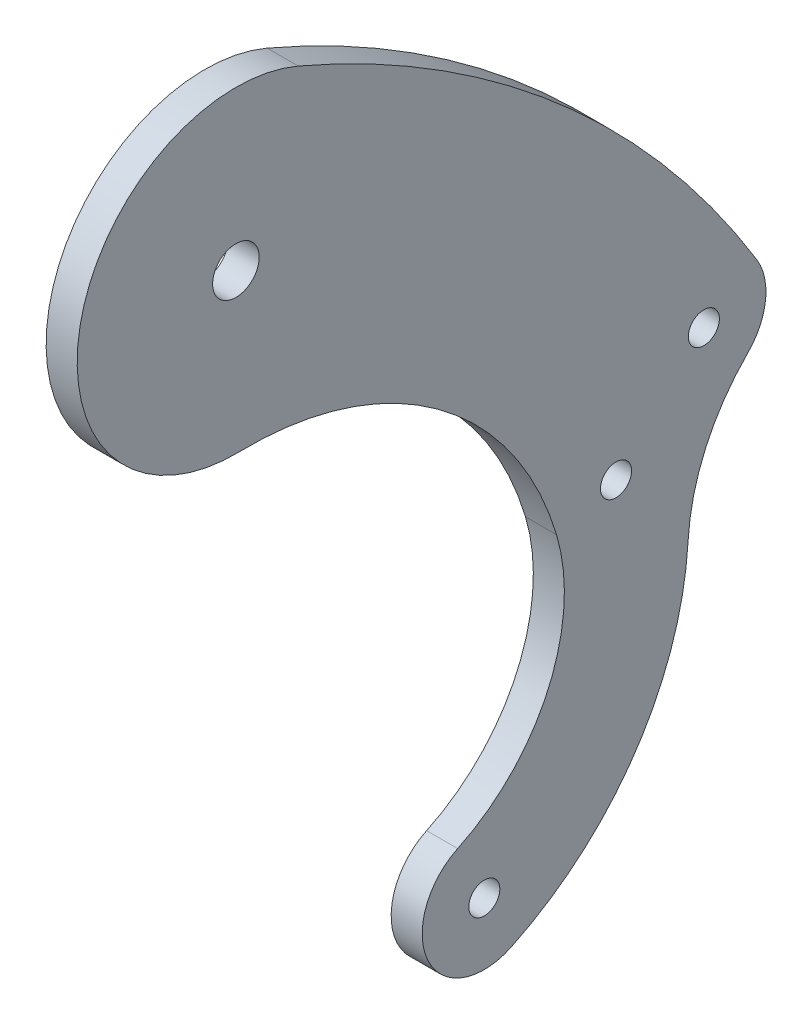
ISO-10303-21;
HEADER;
FILE_DESCRIPTION(('STEP AP214'),'2;1');
FILE_NAME('part.step','',(''),(''),'','','');
FILE_SCHEMA(('AUTOMOTIVE_DESIGN { 1 0 10303 214 1 1 1 1 }'));
ENDSEC;
DATA;
#1=APPLICATION_CONTEXT('core data for automotive mechanical design processes');
#2=APPLICATION_PROTOCOL_DEFINITION('international standard','automotive_design',2000,#1);
#3=PRODUCT_CONTEXT('',#1,'mechanical');
#4=PRODUCT('Part','Part','',(#3));
#5=PRODUCT_RELATED_PRODUCT_CATEGORY('part','',(#4));
#6=PRODUCT_DEFINITION_FORMATION('','',#4);
#7=PRODUCT_DEFINITION_CONTEXT('part definition',#1,'design');
#8=PRODUCT_DEFINITION('design','',#6,#7);
#9=PRODUCT_DEFINITION_SHAPE('','',#8);
#10=(LENGTH_UNIT() NAMED_UNIT(*) SI_UNIT(.MILLI.,.METRE.));
#11=(NAMED_UNIT(*) PLANE_ANGLE_UNIT() SI_UNIT($,.RADIAN.));
#12=(NAMED_UNIT(*) SI_UNIT($,.STERADIAN.) SOLID_ANGLE_UNIT());
#13=UNCERTAINTY_MEASURE_WITH_UNIT(LENGTH_MEASURE(1.E-05),#10,'distance_accuracy_value','');
#14=(GEOMETRIC_REPRESENTATION_CONTEXT(3) GLOBAL_UNCERTAINTY_ASSIGNED_CONTEXT((#13)) GLOBAL_UNIT_ASSIGNED_CONTEXT((#10,
#11,#12)) REPRESENTATION_CONTEXT('',''));
#15=CARTESIAN_POINT('',(0.,0.,0.));
#16=DIRECTION('',(0.,0.,1.));
#17=DIRECTION('',(1.,0.,0.));
#18=AXIS2_PLACEMENT_3D('',#15,#16,#17);
#19=CARTESIAN_POINT('',(6.35,-20.6574132292045,-56.5784377134809));
#20=DIRECTION('',(1.,0.,0.));
#21=DIRECTION('',(0.,0.,-1.));
#22=AXIS2_PLACEMENT_3D('',#19,#20,#21);
#23=PLANE('',#22);
#24=CARTESIAN_POINT('',(6.35,17.9605122421383,-17.9605122421383));
#25=DIRECTION('',(1.,0.,0.));
#26=DIRECTION('',(0.,0.,-1.));
#27=AXIS2_PLACEMENT_3D('',#24,#25,#26);
#28=CIRCLE('',#27,12.7);
#29=CARTESIAN_POINT('',(6.35,8.98025612106918,-26.9407683632074));
#30=VERTEX_POINT('',#29);
#31=CARTESIAN_POINT('',(6.35,24.5652070339192,-28.808000739824));
#32=VERTEX_POINT('',#31);
#33=EDGE_CURVE('E91',#30,#32,#28,.T.);
#34=ORIENTED_EDGE('',*,*,#33,.T.);
#35=CARTESIAN_POINT('',(6.35,-81.1099096345746,144.751815223147));
#36=DIRECTION('',(1.,0.,0.));
#37=DIRECTION('',(0.,0.,-1.));
#38=AXIS2_PLACEMENT_3D('',#35,#36,#37);
#39=CIRCLE('',#38,203.2);
#40=CARTESIAN_POINT('',(6.35,105.785714804745,65.000542095774));
#41=VERTEX_POINT('',#40);
#42=EDGE_CURVE('E116',#32,#41,#39,.T.);
#43=ORIENTED_EDGE('',*,*,#42,.T.);
#44=CARTESIAN_POINT('',(6.35,75.9292316367925,77.7407683632074));
#45=DIRECTION('',(1.,0.,0.));
#46=DIRECTION('',(0.,0.,-1.));
#47=AXIS2_PLACEMENT_3D('',#44,#45,#46);
#48=CIRCLE('',#47,32.4610990649367);
#49=CARTESIAN_POINT('',(6.35,43.4766855118554,76.995649236854));
#50=VERTEX_POINT('',#49);
#51=EDGE_CURVE('E126',#41,#50,#48,.T.);
#52=ORIENTED_EDGE('',*,*,#51,.T.);
#53=CARTESIAN_POINT('',(6.35,-22.5935751300844,75.4786584066758));
#54=DIRECTION('',(-1.,0.,0.));
#55=DIRECTION('',(0.,0.,-1.));
#56=AXIS2_PLACEMENT_3D('',#53,#54,#55);
#57=CIRCLE('',#56,66.0876736046345);
#58=CARTESIAN_POINT('',(6.35,-3.64191999870387,12.1666108149739));
#59=VERTEX_POINT('',#58);
#60=EDGE_CURVE('E132',#50,#59,#57,.T.);
#61=ORIENTED_EDGE('',*,*,#60,.T.);
#62=CARTESIAN_POINT('',(6.35,-14.6007147114311,48.7768027792118));
#63=DIRECTION('',(-1.,0.,0.));
#64=DIRECTION('',(0.,0.,1.));
#65=AXIS2_PLACEMENT_3D('',#62,#63,#64);
#66=CIRCLE('',#65,38.215197725696);
#67=CARTESIAN_POINT('',(6.35,-49.1230213746839,32.3874257360668));
#68=VERTEX_POINT('',#67);
#69=EDGE_CURVE('E139',#59,#68,#66,.T.);
#70=ORIENTED_EDGE('',*,*,#69,.T.);
#71=CARTESIAN_POINT('',(6.35,-60.5957683632075,26.9407683632074));
#72=DIRECTION('',(1.,0.,0.));
#73=DIRECTION('',(0.,0.,-1.));
#74=AXIS2_PLACEMENT_3D('',#71,#72,#73);
#75=CIRCLE('',#74,12.7);
#76=CARTESIAN_POINT('',(6.35,-72.0685153517311,21.494110990348));
#77=VERTEX_POINT('',#76);
#78=EDGE_CURVE('E143',#68,#77,#75,.T.);
#79=ORIENTED_EDGE('',*,*,#78,.T.);
#80=CARTESIAN_POINT('',(6.35,-14.6007147114311,48.7768027792118));
#81=DIRECTION('',(1.,0.,0.));
#82=DIRECTION('',(0.,0.,1.));
#83=AXIS2_PLACEMENT_3D('',#80,#81,#82);
#84=CIRCLE('',#83,63.615197725696);
#85=CARTESIAN_POINT('',(6.35,-18.2518189002019,-14.733533543958));
#86=VERTEX_POINT('',#85);
#87=EDGE_CURVE('E57',#77,#86,#84,.T.);
#88=ORIENTED_EDGE('',*,*,#87,.T.);
#89=CARTESIAN_POINT('',(6.35,-20.6574132292045,-56.5784377134809));
#90=DIRECTION('',(-1.,0.,0.));
#91=DIRECTION('',(0.,0.,-1.));
#92=AXIS2_PLACEMENT_3D('',#89,#90,#91);
#93=CIRCLE('',#92,41.9139939522862);
#94=EDGE_CURVE('E136',#86,#30,#93,.T.);
#95=ORIENTED_EDGE('',*,*,#94,.T.);
#96=EDGE_LOOP('',(#34,#43,#52,#61,#70,#79,#88,#95));
#97=FACE_BOUND('',#96,.T.);
#98=CARTESIAN_POINT('',(6.35,17.9605122421383,-17.9605122421383));
#99=DIRECTION('',(1.,0.,0.));
#100=DIRECTION('',(0.,0.,-1.));
#101=AXIS2_PLACEMENT_3D('',#98,#99,#100);
#102=CIRCLE('',#101,3.175);
#103=CARTESIAN_POINT('',(6.35,17.9605122421383,-21.1355122421383));
#104=VERTEX_POINT('',#103);
#105=EDGE_CURVE('E219',#104,#104,#102,.T.);
#106=ORIENTED_EDGE('',*,*,#105,.F.);
#107=EDGE_LOOP('',(#106));
#108=FACE_BOUND('',#107,.T.);
#109=CARTESIAN_POINT('',(6.35,0.,0.));
#110=DIRECTION('',(1.,0.,0.));
#111=DIRECTION('',(0.,0.,-1.));
#112=AXIS2_PLACEMENT_3D('',#109,#110,#111);
#113=CIRCLE('',#112,3.175);
#114=CARTESIAN_POINT('',(6.35,0.,-3.175));
#115=VERTEX_POINT('',#114);
#116=EDGE_CURVE('E157',#115,#115,#113,.T.);
#117=ORIENTED_EDGE('',*,*,#116,.F.);
#118=EDGE_LOOP('',(#117));
#119=FACE_BOUND('',#118,.T.);
#120=CARTESIAN_POINT('',(6.35,-60.5957683632075,26.9407683632074));
#121=DIRECTION('',(1.,0.,0.));
#122=DIRECTION('',(0.,0.,-1.));
#123=AXIS2_PLACEMENT_3D('',#120,#121,#122);
#124=CIRCLE('',#123,3.175);
#125=CARTESIAN_POINT('',(6.35,-60.5957683632075,23.7657683632074));
#126=VERTEX_POINT('',#125);
#127=EDGE_CURVE('E211',#126,#126,#124,.T.);
#128=ORIENTED_EDGE('',*,*,#127,.F.);
#129=EDGE_LOOP('',(#128));
#130=FACE_BOUND('',#129,.T.);
#131=CARTESIAN_POINT('',(6.35,75.9292316367925,77.7407683632074));
#132=DIRECTION('',(1.,0.,0.));
#133=DIRECTION('',(0.,0.,-1.));
#134=AXIS2_PLACEMENT_3D('',#131,#132,#133);
#135=CIRCLE('',#134,4.7625);
#136=CARTESIAN_POINT('',(6.35,75.9292316367925,72.9782683632074));
#137=VERTEX_POINT('',#136);
#138=EDGE_CURVE('E127',#137,#137,#135,.T.);
#139=ORIENTED_EDGE('',*,*,#138,.F.);
#140=EDGE_LOOP('',(#139));
#141=FACE_BOUND('',#140,.T.);
#142=ADVANCED_FACE('F39',(#97,#108,#119,#130,#141),#23,.T.);
#143=CARTESIAN_POINT('',(0.,-20.6574132292045,-56.5784377134809));
#144=DIRECTION('',(1.,0.,0.));
#145=DIRECTION('',(0.,0.,-1.));
#146=AXIS2_PLACEMENT_3D('',#143,#144,#145);
#147=PLANE('',#146);
#148=CARTESIAN_POINT('',(0.,-20.6574132292045,-56.5784377134809));
#149=DIRECTION('',(-1.,0.,0.));
#150=DIRECTION('',(0.,0.,-1.));
#151=AXIS2_PLACEMENT_3D('',#148,#149,#150);
#152=CIRCLE('',#151,41.9139939522862);
#153=CARTESIAN_POINT('',(0.,-18.2518189002019,-14.733533543958));
#154=VERTEX_POINT('',#153);
#155=CARTESIAN_POINT('',(0.,8.98025612106918,-26.9407683632074));
#156=VERTEX_POINT('',#155);
#157=EDGE_CURVE('E153',#154,#156,#152,.T.);
#158=ORIENTED_EDGE('',*,*,#157,.F.);
#159=CARTESIAN_POINT('',(0.,-14.6007147114311,48.7768027792118));
#160=DIRECTION('',(1.,0.,0.));
#161=DIRECTION('',(0.,0.,1.));
#162=AXIS2_PLACEMENT_3D('',#159,#160,#161);
#163=CIRCLE('',#162,63.615197725696);
#164=CARTESIAN_POINT('',(0.,-72.0685153517311,21.494110990348));
#165=VERTEX_POINT('',#164);
#166=EDGE_CURVE('E84',#165,#154,#163,.T.);
#167=ORIENTED_EDGE('',*,*,#166,.F.);
#168=CARTESIAN_POINT('',(0.,-60.5957683632075,26.9407683632074));
#169=DIRECTION('',(1.,0.,0.));
#170=DIRECTION('',(0.,0.,-1.));
#171=AXIS2_PLACEMENT_3D('',#168,#169,#170);
#172=CIRCLE('',#171,12.7);
#173=CARTESIAN_POINT('',(0.,-49.1230213746839,32.3874257360668));
#174=VERTEX_POINT('',#173);
#175=EDGE_CURVE('E78',#174,#165,#172,.T.);
#176=ORIENTED_EDGE('',*,*,#175,.F.);
#177=CARTESIAN_POINT('',(0.,-14.6007147114311,48.7768027792118));
#178=DIRECTION('',(-1.,0.,0.));
#179=DIRECTION('',(0.,0.,1.));
#180=AXIS2_PLACEMENT_3D('',#177,#178,#179);
#181=CIRCLE('',#180,38.215197725696);
#182=CARTESIAN_POINT('',(0.,-3.64191999870387,12.1666108149739));
#183=VERTEX_POINT('',#182);
#184=EDGE_CURVE('E160',#183,#174,#181,.T.);
#185=ORIENTED_EDGE('',*,*,#184,.F.);
#186=CARTESIAN_POINT('',(0.,-22.5935751300844,75.4786584066758));
#187=DIRECTION('',(1.,0.,0.));
#188=DIRECTION('',(0.,0.,-1.));
#189=AXIS2_PLACEMENT_3D('',#186,#187,#188);
#190=CIRCLE('',#189,66.0876736046345);
#191=CARTESIAN_POINT('',(0.,43.4766855118553,76.995649236854));
#192=VERTEX_POINT('',#191);
#193=EDGE_CURVE('E188',#183,#192,#190,.T.);
#194=ORIENTED_EDGE('',*,*,#193,.T.);
#195=CARTESIAN_POINT('',(0.,75.9292316367925,77.7407683632074));
#196=DIRECTION('',(1.,0.,0.));
#197=DIRECTION('',(0.,0.,-1.));
#198=AXIS2_PLACEMENT_3D('',#195,#196,#197);
#199=CIRCLE('',#198,32.4610990649367);
#200=CARTESIAN_POINT('',(0.,105.785714804745,65.0005420957741));
#201=VERTEX_POINT('',#200);
#202=EDGE_CURVE('E363',#192,#201,#199,.F.);
#203=ORIENTED_EDGE('',*,*,#202,.T.);
#204=CARTESIAN_POINT('',(0.,-81.1099096345746,144.751815223147));
#205=DIRECTION('',(1.,0.,0.));
#206=DIRECTION('',(0.,0.,-1.));
#207=AXIS2_PLACEMENT_3D('',#204,#205,#206);
#208=CIRCLE('',#207,203.2);
#209=CARTESIAN_POINT('',(0.,24.5652070339192,-28.8080007398239));
#210=VERTEX_POINT('',#209);
#211=EDGE_CURVE('E203',#201,#210,#208,.F.);
#212=ORIENTED_EDGE('',*,*,#211,.T.);
#213=CARTESIAN_POINT('',(0.,17.9605122421383,-17.9605122421383));
#214=DIRECTION('',(1.,0.,0.));
#215=DIRECTION('',(0.,0.,-1.));
#216=AXIS2_PLACEMENT_3D('',#213,#214,#215);
#217=CIRCLE('',#216,12.7);
#218=EDGE_CURVE('E130',#156,#210,#217,.T.);
#219=ORIENTED_EDGE('',*,*,#218,.F.);
#220=EDGE_LOOP('',(#158,#167,#176,#185,#194,#203,#212,#219));
#221=FACE_BOUND('',#220,.T.);
#222=CARTESIAN_POINT('',(0.,0.,0.));
#223=DIRECTION('',(1.,0.,0.));
#224=DIRECTION('',(0.,0.,-1.));
#225=AXIS2_PLACEMENT_3D('',#222,#223,#224);
#226=CIRCLE('',#225,3.175);
#227=CARTESIAN_POINT('',(0.,0.,-3.175));
#228=VERTEX_POINT('',#227);
#229=EDGE_CURVE('E223',#228,#228,#226,.T.);
#230=ORIENTED_EDGE('',*,*,#229,.T.);
#231=EDGE_LOOP('',(#230));
#232=FACE_BOUND('',#231,.T.);
#233=CARTESIAN_POINT('',(0.,17.9605122421383,-17.9605122421383));
#234=DIRECTION('',(1.,0.,0.));
#235=DIRECTION('',(0.,0.,-1.));
#236=AXIS2_PLACEMENT_3D('',#233,#234,#235);
#237=CIRCLE('',#236,3.175);
#238=CARTESIAN_POINT('',(0.,17.9605122421383,-21.1355122421383));
#239=VERTEX_POINT('',#238);
#240=EDGE_CURVE('E215',#239,#239,#237,.T.);
#241=ORIENTED_EDGE('',*,*,#240,.T.);
#242=EDGE_LOOP('',(#241));
#243=FACE_BOUND('',#242,.T.);
#244=CARTESIAN_POINT('',(0.,-60.5957683632075,26.9407683632074));
#245=DIRECTION('',(1.,0.,0.));
#246=DIRECTION('',(0.,0.,-1.));
#247=AXIS2_PLACEMENT_3D('',#244,#245,#246);
#248=CIRCLE('',#247,3.175);
#249=CARTESIAN_POINT('',(0.,-60.5957683632075,23.7657683632074));
#250=VERTEX_POINT('',#249);
#251=EDGE_CURVE('E210',#250,#250,#248,.T.);
#252=ORIENTED_EDGE('',*,*,#251,.T.);
#253=EDGE_LOOP('',(#252));
#254=FACE_BOUND('',#253,.T.);
#255=CARTESIAN_POINT('',(0.,75.9292316367925,77.7407683632074));
#256=DIRECTION('',(1.,0.,0.));
#257=DIRECTION('',(0.,0.,-1.));
#258=AXIS2_PLACEMENT_3D('',#255,#256,#257);
#259=CIRCLE('',#258,4.7625);
#260=CARTESIAN_POINT('',(0.,75.9292316367925,72.9782683632074));
#261=VERTEX_POINT('',#260);
#262=EDGE_CURVE('E206',#261,#261,#259,.F.);
#263=ORIENTED_EDGE('',*,*,#262,.F.);
#264=EDGE_LOOP('',(#263));
#265=FACE_BOUND('',#264,.T.);
#266=ADVANCED_FACE('F186',(#221,#232,#243,#254,#265),#147,.F.);
#267=CARTESIAN_POINT('',(6.35,-20.6574132292045,-56.5784377134809));
#268=DIRECTION('',(-1.,0.,0.));
#269=DIRECTION('',(0.,0.,1.));
#270=AXIS2_PLACEMENT_3D('',#267,#268,#269);
#271=CYLINDRICAL_SURFACE('',#270,41.9139939522862);
#272=ORIENTED_EDGE('',*,*,#157,.T.);
#273=DIRECTION('',(-1.,0.,0.));
#274=VECTOR('',#273,1.);
#275=CARTESIAN_POINT('',(6.35,8.98025612106918,-26.9407683632074));
#276=LINE('',#275,#274);
#277=EDGE_CURVE('E11',#30,#156,#276,.T.);
#278=ORIENTED_EDGE('',*,*,#277,.F.);
#279=ORIENTED_EDGE('',*,*,#94,.F.);
#280=DIRECTION('',(-1.,0.,0.));
#281=VECTOR('',#280,1.);
#282=CARTESIAN_POINT('',(6.35,-18.2518189002019,-14.733533543958));
#283=LINE('',#282,#281);
#284=EDGE_CURVE('E152',#86,#154,#283,.T.);
#285=ORIENTED_EDGE('',*,*,#284,.T.);
#286=EDGE_LOOP('',(#272,#278,#279,#285));
#287=FACE_BOUND('',#286,.T.);
#288=ADVANCED_FACE('F41',(#287),#271,.F.);
#289=CARTESIAN_POINT('',(6.35,17.9605122421383,-17.9605122421383));
#290=DIRECTION('',(-1.,0.,0.));
#291=DIRECTION('',(0.,0.,1.));
#292=AXIS2_PLACEMENT_3D('',#289,#290,#291);
#293=CYLINDRICAL_SURFACE('',#292,12.7);
#294=ORIENTED_EDGE('',*,*,#218,.T.);
#295=DIRECTION('',(1.,0.,0.));
#296=VECTOR('',#295,1.);
#297=CARTESIAN_POINT('',(-178.535622902211,24.5652070339192,-28.808000739824));
#298=LINE('',#297,#296);
#299=EDGE_CURVE('E119',#210,#32,#298,.T.);
#300=ORIENTED_EDGE('',*,*,#299,.T.);
#301=ORIENTED_EDGE('',*,*,#33,.F.);
#302=ORIENTED_EDGE('',*,*,#277,.T.);
#303=EDGE_LOOP('',(#294,#300,#301,#302));
#304=FACE_BOUND('',#303,.T.);
#305=ADVANCED_FACE('F129',(#304),#293,.T.);
#306=CARTESIAN_POINT('',(6.35,-14.6007147114311,48.7768027792118));
#307=DIRECTION('',(-1.,0.,0.));
#308=DIRECTION('',(0.,0.,1.));
#309=AXIS2_PLACEMENT_3D('',#306,#307,#308);
#310=CYLINDRICAL_SURFACE('',#309,38.215197725696);
#311=ORIENTED_EDGE('',*,*,#184,.T.);
#312=DIRECTION('',(-1.,0.,0.));
#313=VECTOR('',#312,1.);
#314=CARTESIAN_POINT('',(6.35,-49.1230213746839,32.3874257360668));
#315=LINE('',#314,#313);
#316=EDGE_CURVE('E172',#68,#174,#315,.T.);
#317=ORIENTED_EDGE('',*,*,#316,.F.);
#318=ORIENTED_EDGE('',*,*,#69,.F.);
#319=DIRECTION('',(-1.,0.,0.));
#320=VECTOR('',#319,1.);
#321=CARTESIAN_POINT('',(6.35,-3.64191999870387,12.1666108149739));
#322=LINE('',#321,#320);
#323=EDGE_CURVE('E49',#59,#183,#322,.T.);
#324=ORIENTED_EDGE('',*,*,#323,.T.);
#325=EDGE_LOOP('',(#311,#317,#318,#324));
#326=FACE_BOUND('',#325,.T.);
#327=ADVANCED_FACE('F179',(#326),#310,.F.);
#328=CARTESIAN_POINT('',(6.35,-60.5957683632075,26.9407683632074));
#329=DIRECTION('',(-1.,0.,0.));
#330=DIRECTION('',(0.,0.,1.));
#331=AXIS2_PLACEMENT_3D('',#328,#329,#330);
#332=CYLINDRICAL_SURFACE('',#331,12.7);
#333=ORIENTED_EDGE('',*,*,#175,.T.);
#334=DIRECTION('',(-1.,0.,0.));
#335=VECTOR('',#334,1.);
#336=CARTESIAN_POINT('',(6.35,-72.0685153517311,21.494110990348));
#337=LINE('',#336,#335);
#338=EDGE_CURVE('E169',#77,#165,#337,.T.);
#339=ORIENTED_EDGE('',*,*,#338,.F.);
#340=ORIENTED_EDGE('',*,*,#78,.F.);
#341=ORIENTED_EDGE('',*,*,#316,.T.);
#342=EDGE_LOOP('',(#333,#339,#340,#341));
#343=FACE_BOUND('',#342,.T.);
#344=ADVANCED_FACE('F193',(#343),#332,.T.);
#345=CARTESIAN_POINT('',(6.35,-14.6007147114311,48.7768027792118));
#346=DIRECTION('',(-1.,0.,0.));
#347=DIRECTION('',(0.,0.,1.));
#348=AXIS2_PLACEMENT_3D('',#345,#346,#347);
#349=CYLINDRICAL_SURFACE('',#348,63.615197725696);
#350=ORIENTED_EDGE('',*,*,#166,.T.);
#351=ORIENTED_EDGE('',*,*,#284,.F.);
#352=ORIENTED_EDGE('',*,*,#87,.F.);
#353=ORIENTED_EDGE('',*,*,#338,.T.);
#354=EDGE_LOOP('',(#350,#351,#352,#353));
#355=FACE_BOUND('',#354,.T.);
#356=ADVANCED_FACE('F191',(#355),#349,.T.);
#357=CARTESIAN_POINT('',(6.35,0.,0.));
#358=DIRECTION('',(-1.,0.,0.));
#359=DIRECTION('',(0.,0.,1.));
#360=AXIS2_PLACEMENT_3D('',#357,#358,#359);
#361=CYLINDRICAL_SURFACE('',#360,3.175);
#362=ORIENTED_EDGE('',*,*,#116,.T.);
#363=EDGE_LOOP('',(#362));
#364=FACE_BOUND('',#363,.T.);
#365=ORIENTED_EDGE('',*,*,#229,.F.);
#366=EDGE_LOOP('',(#365));
#367=FACE_BOUND('',#366,.T.);
#368=ADVANCED_FACE('F234',(#364,#367),#361,.F.);
#369=CARTESIAN_POINT('',(6.35,17.9605122421383,-17.9605122421383));
#370=DIRECTION('',(-1.,0.,0.));
#371=DIRECTION('',(0.,0.,1.));
#372=AXIS2_PLACEMENT_3D('',#369,#370,#371);
#373=CYLINDRICAL_SURFACE('',#372,3.175);
#374=ORIENTED_EDGE('',*,*,#105,.T.);
#375=EDGE_LOOP('',(#374));
#376=FACE_BOUND('',#375,.T.);
#377=ORIENTED_EDGE('',*,*,#240,.F.);
#378=EDGE_LOOP('',(#377));
#379=FACE_BOUND('',#378,.T.);
#380=ADVANCED_FACE('F236',(#376,#379),#373,.F.);
#381=CARTESIAN_POINT('',(6.35,-60.5957683632075,26.9407683632074));
#382=DIRECTION('',(-1.,0.,0.));
#383=DIRECTION('',(0.,0.,1.));
#384=AXIS2_PLACEMENT_3D('',#381,#382,#383);
#385=CYLINDRICAL_SURFACE('',#384,3.175);
#386=ORIENTED_EDGE('',*,*,#127,.T.);
#387=EDGE_LOOP('',(#386));
#388=FACE_BOUND('',#387,.T.);
#389=ORIENTED_EDGE('',*,*,#251,.F.);
#390=EDGE_LOOP('',(#389));
#391=FACE_BOUND('',#390,.T.);
#392=ADVANCED_FACE('F243',(#388,#391),#385,.F.);
#393=CARTESIAN_POINT('',(-178.535622902211,-81.1099096345746,144.751815223147));
#394=DIRECTION('',(1.,0.,0.));
#395=DIRECTION('',(0.,0.,-1.));
#396=AXIS2_PLACEMENT_3D('',#393,#394,#395);
#397=CYLINDRICAL_SURFACE('',#396,203.2);
#398=ORIENTED_EDGE('',*,*,#211,.F.);
#399=DIRECTION('',(1.,0.,0.));
#400=VECTOR('',#399,1.);
#401=CARTESIAN_POINT('',(-178.535622902211,105.785714804745,65.000542095774));
#402=LINE('',#401,#400);
#403=EDGE_CURVE('E122',#201,#41,#402,.T.);
#404=ORIENTED_EDGE('',*,*,#403,.T.);
#405=ORIENTED_EDGE('',*,*,#42,.F.);
#406=ORIENTED_EDGE('',*,*,#299,.F.);
#407=EDGE_LOOP('',(#398,#404,#405,#406));
#408=FACE_BOUND('',#407,.T.);
#409=ADVANCED_FACE('F118',(#408),#397,.T.);
#410=CARTESIAN_POINT('',(-178.535622902211,75.9292316367925,77.7407683632074));
#411=DIRECTION('',(1.,0.,0.));
#412=DIRECTION('',(0.,0.,-1.));
#413=AXIS2_PLACEMENT_3D('',#410,#411,#412);
#414=CYLINDRICAL_SURFACE('',#413,32.4610990649367);
#415=ORIENTED_EDGE('',*,*,#202,.F.);
#416=DIRECTION('',(1.,0.,0.));
#417=VECTOR('',#416,1.);
#418=CARTESIAN_POINT('',(-178.535622902211,43.4766855118554,76.995649236854));
#419=LINE('',#418,#417);
#420=EDGE_CURVE('E200',#192,#50,#419,.T.);
#421=ORIENTED_EDGE('',*,*,#420,.T.);
#422=ORIENTED_EDGE('',*,*,#51,.F.);
#423=ORIENTED_EDGE('',*,*,#403,.F.);
#424=EDGE_LOOP('',(#415,#421,#422,#423));
#425=FACE_BOUND('',#424,.T.);
#426=ADVANCED_FACE('F321',(#425),#414,.T.);
#427=CARTESIAN_POINT('',(-178.535622902211,-22.5935751300844,75.4786584066758));
#428=DIRECTION('',(1.,0.,0.));
#429=DIRECTION('',(0.,0.,-1.));
#430=AXIS2_PLACEMENT_3D('',#427,#428,#429);
#431=CYLINDRICAL_SURFACE('',#430,66.0876736046345);
#432=ORIENTED_EDGE('',*,*,#193,.F.);
#433=ORIENTED_EDGE('',*,*,#323,.F.);
#434=ORIENTED_EDGE('',*,*,#60,.F.);
#435=ORIENTED_EDGE('',*,*,#420,.F.);
#436=EDGE_LOOP('',(#432,#433,#434,#435));
#437=FACE_BOUND('',#436,.T.);
#438=ADVANCED_FACE('F327',(#437),#431,.F.);
#439=CARTESIAN_POINT('',(-178.535622902211,75.9292316367925,77.7407683632074));
#440=DIRECTION('',(1.,0.,0.));
#441=DIRECTION('',(0.,0.,-1.));
#442=AXIS2_PLACEMENT_3D('',#439,#440,#441);
#443=CYLINDRICAL_SURFACE('',#442,4.7625);
#444=ORIENTED_EDGE('',*,*,#262,.T.);
#445=EDGE_LOOP('',(#444));
#446=FACE_BOUND('',#445,.T.);
#447=ORIENTED_EDGE('',*,*,#138,.T.);
#448=EDGE_LOOP('',(#447));
#449=FACE_BOUND('',#448,.T.);
#450=ADVANCED_FACE('F335',(#446,#449),#443,.F.);
#451=CLOSED_SHELL('',(#142,#266,#288,#305,#327,#344,#356,#368,#380,#392,#409,#426,#438,#450));
#452=MANIFOLD_SOLID_BREP('B2',#451);
#453=ADVANCED_BREP_SHAPE_REPRESENTATION('',(#18,#452),#14);
#454=SHAPE_DEFINITION_REPRESENTATION(#9,#453);
ENDSEC;
END-ISO-10303-21;
